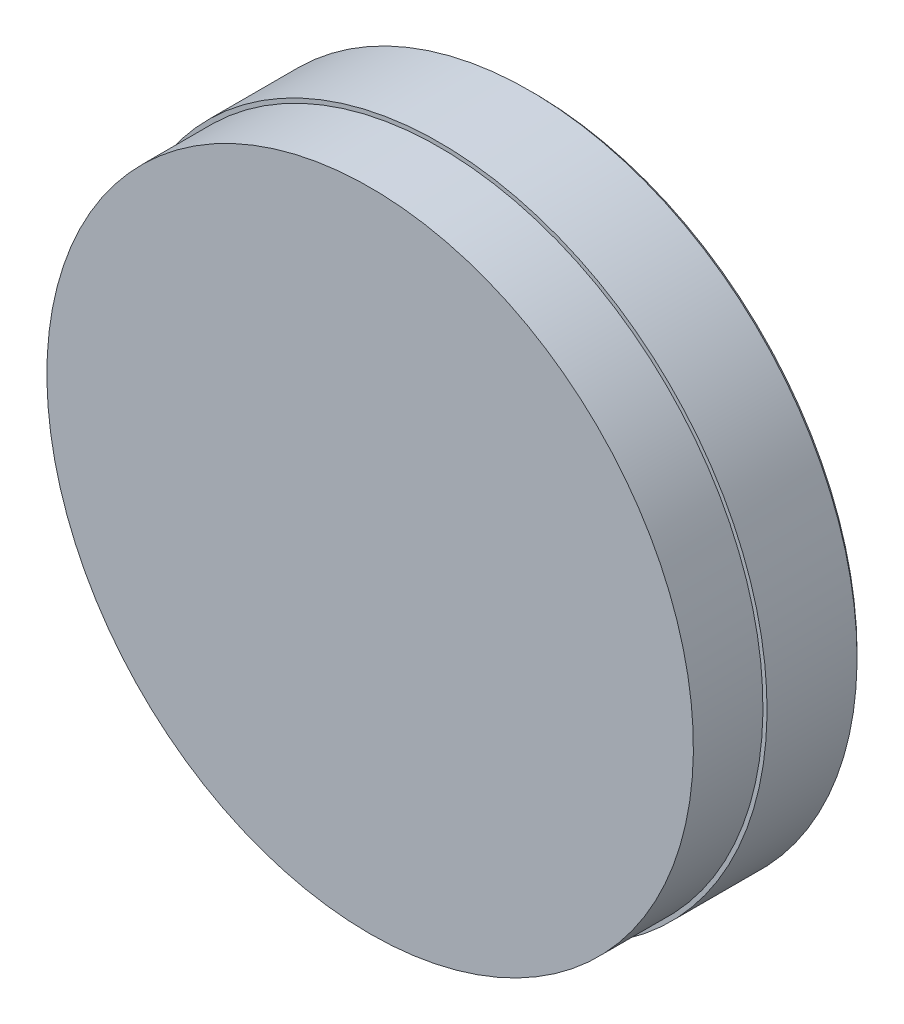
ISO-10303-21;
HEADER;
FILE_DESCRIPTION(('STEP AP214'),'2;1');
FILE_NAME('part.step','',(''),(''),'','','');
FILE_SCHEMA(('AUTOMOTIVE_DESIGN { 1 0 10303 214 1 1 1 1 }'));
ENDSEC;
DATA;
#1=APPLICATION_CONTEXT('core data for automotive mechanical design processes');
#2=APPLICATION_PROTOCOL_DEFINITION('international standard','automotive_design',2000,#1);
#3=PRODUCT_CONTEXT('',#1,'mechanical');
#4=PRODUCT('Part','Part','',(#3));
#5=PRODUCT_RELATED_PRODUCT_CATEGORY('part','',(#4));
#6=PRODUCT_DEFINITION_FORMATION('','',#4);
#7=PRODUCT_DEFINITION_CONTEXT('part definition',#1,'design');
#8=PRODUCT_DEFINITION('design','',#6,#7);
#9=PRODUCT_DEFINITION_SHAPE('','',#8);
#10=(LENGTH_UNIT() NAMED_UNIT(*) SI_UNIT(.MILLI.,.METRE.));
#11=(NAMED_UNIT(*) PLANE_ANGLE_UNIT() SI_UNIT($,.RADIAN.));
#12=(NAMED_UNIT(*) SI_UNIT($,.STERADIAN.) SOLID_ANGLE_UNIT());
#13=UNCERTAINTY_MEASURE_WITH_UNIT(LENGTH_MEASURE(1.E-05),#10,'distance_accuracy_value','');
#14=(GEOMETRIC_REPRESENTATION_CONTEXT(3) GLOBAL_UNCERTAINTY_ASSIGNED_CONTEXT((#13)) GLOBAL_UNIT_ASSIGNED_CONTEXT((#10,
#11,#12)) REPRESENTATION_CONTEXT('',''));
#15=CARTESIAN_POINT('',(0.,0.,0.));
#16=DIRECTION('',(0.,0.,1.));
#17=DIRECTION('',(1.,0.,0.));
#18=AXIS2_PLACEMENT_3D('',#15,#16,#17);
#19=CARTESIAN_POINT('',(1503.75685432934,-78.9902183111325,1476.));
#20=DIRECTION('',(0.,0.,-1.));
#21=DIRECTION('',(0.,1.,0.));
#22=AXIS2_PLACEMENT_3D('',#19,#20,#21);
#23=PLANE('',#22);
#24=CARTESIAN_POINT('',(1505.,7.24973667202902E-12,1476.));
#25=DIRECTION('',(0.,0.,1.));
#26=DIRECTION('',(0.,-1.,0.));
#27=AXIS2_PLACEMENT_3D('',#24,#25,#26);
#28=CIRCLE('',#27,79.);
#29=CARTESIAN_POINT('',(1505.,-78.9999999999928,1476.));
#30=VERTEX_POINT('',#29);
#31=EDGE_CURVE('E18',#30,#30,#28,.F.);
#32=ORIENTED_EDGE('',*,*,#31,.F.);
#33=EDGE_LOOP('',(#32));
#34=FACE_BOUND('',#33,.T.);
#35=ADVANCED_FACE('F15',(#34),#23,.F.);
#36=CARTESIAN_POINT('',(1505.,7.24975006090515E-12,1484.55221098073));
#37=DIRECTION('',(0.,0.,1.));
#38=DIRECTION('',(0.,-1.,0.));
#39=AXIS2_PLACEMENT_3D('',#36,#37,#38);
#40=CYLINDRICAL_SURFACE('',#39,79.);
#41=CARTESIAN_POINT('',(1505.,7.2497100577541E-12,1459.));
#42=DIRECTION('',(0.,0.,1.));
#43=DIRECTION('',(0.,-1.,0.));
#44=AXIS2_PLACEMENT_3D('',#41,#42,#43);
#45=CIRCLE('',#44,79.);
#46=CARTESIAN_POINT('',(1505.,-78.9999999999928,1459.));
#47=VERTEX_POINT('',#46);
#48=EDGE_CURVE('E33',#47,#47,#45,.T.);
#49=ORIENTED_EDGE('',*,*,#48,.T.);
#50=EDGE_LOOP('',(#49));
#51=FACE_BOUND('',#50,.T.);
#52=ORIENTED_EDGE('',*,*,#31,.T.);
#53=EDGE_LOOP('',(#52));
#54=FACE_BOUND('',#53,.T.);
#55=ADVANCED_FACE('F40',(#51,#54),#40,.T.);
#56=CARTESIAN_POINT('',(1503.74111830819,-79.9900944922862,1459.));
#57=DIRECTION('',(0.,0.,-1.));
#58=DIRECTION('',(0.,1.,0.));
#59=AXIS2_PLACEMENT_3D('',#56,#57,#58);
#60=PLANE('',#59);
#61=CARTESIAN_POINT('',(1505.,7.2497100577541E-12,1459.));
#62=DIRECTION('',(0.,0.,1.));
#63=DIRECTION('',(0.,-1.,0.));
#64=AXIS2_PLACEMENT_3D('',#61,#62,#63);
#65=CIRCLE('',#64,80.);
#66=CARTESIAN_POINT('',(1505.,-79.9999999999928,1459.));
#67=VERTEX_POINT('',#66);
#68=EDGE_CURVE('E27',#67,#67,#65,.F.);
#69=ORIENTED_EDGE('',*,*,#68,.F.);
#70=EDGE_LOOP('',(#69));
#71=FACE_BOUND('',#70,.T.);
#72=ORIENTED_EDGE('',*,*,#48,.F.);
#73=EDGE_LOOP('',(#72));
#74=FACE_BOUND('',#73,.T.);
#75=ADVANCED_FACE('F47',(#71,#74),#60,.F.);
#76=CARTESIAN_POINT('',(1505.,7.24975006090515E-12,1484.55221098073));
#77=DIRECTION('',(0.,0.,1.));
#78=DIRECTION('',(0.,-1.,0.));
#79=AXIS2_PLACEMENT_3D('',#76,#77,#78);
#80=CYLINDRICAL_SURFACE('',#79,80.);
#81=ORIENTED_EDGE('',*,*,#68,.T.);
#82=EDGE_LOOP('',(#81));
#83=FACE_BOUND('',#82,.T.);
#84=CARTESIAN_POINT('',(1505.,7.24967561575127E-12,1437.));
#85=DIRECTION('',(0.,0.,1.));
#86=DIRECTION('',(0.999876181153667,-0.0157360211476454,0.));
#87=AXIS2_PLACEMENT_3D('',#84,#85,#86);
#88=CIRCLE('',#87,79.9999999999984);
#89=CARTESIAN_POINT('',(1584.99009449229,-1.25888169180436,1437.));
#90=VERTEX_POINT('',#89);
#91=EDGE_CURVE('E22',#90,#90,#88,.F.);
#92=ORIENTED_EDGE('',*,*,#91,.F.);
#93=EDGE_LOOP('',(#92));
#94=FACE_BOUND('',#93,.T.);
#95=ADVANCED_FACE('F56',(#83,#94),#80,.T.);
#96=CARTESIAN_POINT('',(1505.,7.24973466675882E-12,1437.));
#97=DIRECTION('',(0.,0.,1.));
#98=DIRECTION('',(1.,0.,0.));
#99=AXIS2_PLACEMENT_3D('',#96,#97,#98);
#100=CONICAL_SURFACE('',#99,79.9999999999984,0.785398162500131);
#101=ORIENTED_EDGE('',*,*,#91,.T.);
#102=EDGE_LOOP('',(#101));
#103=FACE_BOUND('',#102,.T.);
#104=CARTESIAN_POINT('',(1505.,7.24973466675882E-12,1435.9999999991));
#105=DIRECTION('',(0.,0.,1.));
#106=DIRECTION('',(1.,0.,0.));
#107=AXIS2_PLACEMENT_3D('',#104,#105,#106);
#108=CIRCLE('',#107,79.0000000008976);
#109=CARTESIAN_POINT('',(1584.0000000009,7.24973466675882E-12,1435.9999999991));
#110=VERTEX_POINT('',#109);
#111=EDGE_CURVE('E10',#110,#110,#108,.T.);
#112=ORIENTED_EDGE('',*,*,#111,.T.);
#113=EDGE_LOOP('',(#112));
#114=FACE_BOUND('',#113,.T.);
#115=ADVANCED_FACE('F50',(#103,#114),#100,.T.);
#116=CARTESIAN_POINT('',(1504.3705591541,-39.9950472461395,1436.));
#117=DIRECTION('',(0.,0.,1.));
#118=DIRECTION('',(0.,-1.,0.));
#119=AXIS2_PLACEMENT_3D('',#116,#117,#118);
#120=PLANE('',#119);
#121=ORIENTED_EDGE('',*,*,#111,.F.);
#122=EDGE_LOOP('',(#121));
#123=FACE_BOUND('',#122,.T.);
#124=ADVANCED_FACE('F48',(#123),#120,.F.);
#125=CLOSED_SHELL('',(#35,#55,#75,#95,#115,#124));
#126=MANIFOLD_SOLID_BREP('B1',#125);
#127=ADVANCED_BREP_SHAPE_REPRESENTATION('',(#18,#126),#14);
#128=SHAPE_DEFINITION_REPRESENTATION(#9,#127);
ENDSEC;
END-ISO-10303-21;
